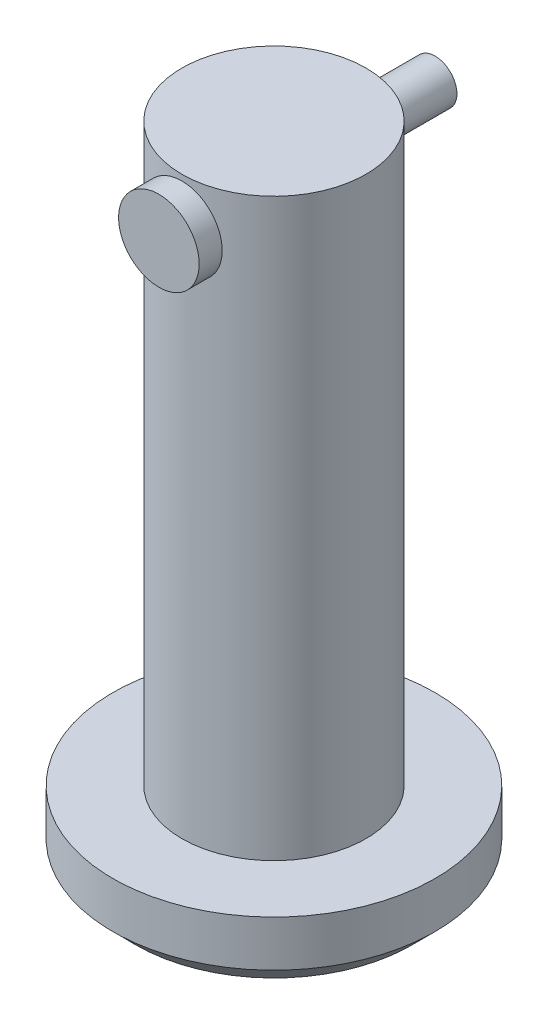
ISO-10303-21;
HEADER;
FILE_DESCRIPTION(('STEP AP214'),'2;1');
FILE_NAME('part.step','',(''),(''),'','','');
FILE_SCHEMA(('AUTOMOTIVE_DESIGN { 1 0 10303 214 1 1 1 1 }'));
ENDSEC;
DATA;
#1=APPLICATION_CONTEXT('core data for automotive mechanical design processes');
#2=APPLICATION_PROTOCOL_DEFINITION('international standard','automotive_design',2000,#1);
#3=PRODUCT_CONTEXT('',#1,'mechanical');
#4=PRODUCT('Part','Part','',(#3));
#5=PRODUCT_RELATED_PRODUCT_CATEGORY('part','',(#4));
#6=PRODUCT_DEFINITION_FORMATION('','',#4);
#7=PRODUCT_DEFINITION_CONTEXT('part definition',#1,'design');
#8=PRODUCT_DEFINITION('design','',#6,#7);
#9=PRODUCT_DEFINITION_SHAPE('','',#8);
#10=(LENGTH_UNIT() NAMED_UNIT(*) SI_UNIT(.MILLI.,.METRE.));
#11=(NAMED_UNIT(*) PLANE_ANGLE_UNIT() SI_UNIT($,.RADIAN.));
#12=(NAMED_UNIT(*) SI_UNIT($,.STERADIAN.) SOLID_ANGLE_UNIT());
#13=UNCERTAINTY_MEASURE_WITH_UNIT(LENGTH_MEASURE(1.E-05),#10,'distance_accuracy_value','');
#14=(GEOMETRIC_REPRESENTATION_CONTEXT(3) GLOBAL_UNCERTAINTY_ASSIGNED_CONTEXT((#13)) GLOBAL_UNIT_ASSIGNED_CONTEXT((#10,
#11,#12)) REPRESENTATION_CONTEXT('',''));
#15=CARTESIAN_POINT('',(0.,0.,0.));
#16=DIRECTION('',(0.,0.,1.));
#17=DIRECTION('',(1.,0.,0.));
#18=AXIS2_PLACEMENT_3D('',#15,#16,#17);
#19=CARTESIAN_POINT('',(0.,23.,-7.));
#20=DIRECTION('',(0.,0.,1.));
#21=DIRECTION('',(1.,0.,0.));
#22=AXIS2_PLACEMENT_3D('',#19,#20,#21);
#23=CYLINDRICAL_SURFACE('',#22,0.95);
#24=CARTESIAN_POINT('',(0.,23.,-7.));
#25=DIRECTION('',(0.,0.,1.));
#26=DIRECTION('',(1.,0.,0.));
#27=AXIS2_PLACEMENT_3D('',#24,#25,#26);
#28=CIRCLE('',#27,0.95);
#29=CARTESIAN_POINT('',(0.95,23.,-7.));
#30=VERTEX_POINT('',#29);
#31=EDGE_CURVE('E11',#30,#30,#28,.T.);
#32=ORIENTED_EDGE('',*,*,#31,.T.);
#33=EDGE_LOOP('',(#32));
#34=FACE_BOUND('',#33,.T.);
#35=CARTESIAN_POINT('',(0.,23.,4.));
#36=DIRECTION('',(0.,0.,1.));
#37=DIRECTION('',(1.,0.,0.));
#38=AXIS2_PLACEMENT_3D('',#35,#36,#37);
#39=CIRCLE('',#38,0.95);
#40=CARTESIAN_POINT('',(0.95,23.,4.));
#41=VERTEX_POINT('',#40);
#42=EDGE_CURVE('E41',#41,#41,#39,.F.);
#43=ORIENTED_EDGE('',*,*,#42,.T.);
#44=EDGE_LOOP('',(#43));
#45=FACE_BOUND('',#44,.T.);
#46=ADVANCED_FACE('F38',(#34,#45),#23,.T.);
#47=CARTESIAN_POINT('',(0.,23.,-7.));
#48=DIRECTION('',(0.,0.,1.));
#49=DIRECTION('',(1.,0.,0.));
#50=AXIS2_PLACEMENT_3D('',#47,#48,#49);
#51=PLANE('',#50);
#52=ORIENTED_EDGE('',*,*,#31,.F.);
#53=EDGE_LOOP('',(#52));
#54=FACE_BOUND('',#53,.T.);
#55=ADVANCED_FACE('F70',(#54),#51,.F.);
#56=CARTESIAN_POINT('',(0.,23.,4.));
#57=DIRECTION('',(0.,0.,1.));
#58=DIRECTION('',(1.,0.,0.));
#59=AXIS2_PLACEMENT_3D('',#56,#57,#58);
#60=CYLINDRICAL_SURFACE('',#59,1.75);
#61=CARTESIAN_POINT('',(0.,23.,4.));
#62=DIRECTION('',(0.,0.,1.));
#63=DIRECTION('',(1.,0.,0.));
#64=AXIS2_PLACEMENT_3D('',#61,#62,#63);
#65=CIRCLE('',#64,1.75);
#66=CARTESIAN_POINT('',(1.75,23.,4.));
#67=VERTEX_POINT('',#66);
#68=EDGE_CURVE('E48',#67,#67,#65,.T.);
#69=ORIENTED_EDGE('',*,*,#68,.T.);
#70=EDGE_LOOP('',(#69));
#71=FACE_BOUND('',#70,.T.);
#72=CARTESIAN_POINT('',(0.,23.,5.));
#73=DIRECTION('',(0.,0.,1.));
#74=DIRECTION('',(1.,0.,0.));
#75=AXIS2_PLACEMENT_3D('',#72,#73,#74);
#76=CIRCLE('',#75,1.75);
#77=CARTESIAN_POINT('',(1.75,23.,5.));
#78=VERTEX_POINT('',#77);
#79=EDGE_CURVE('E50',#78,#78,#76,.T.);
#80=ORIENTED_EDGE('',*,*,#79,.F.);
#81=EDGE_LOOP('',(#80));
#82=FACE_BOUND('',#81,.T.);
#83=ADVANCED_FACE('F56',(#71,#82),#60,.T.);
#84=CARTESIAN_POINT('',(0.,23.,4.));
#85=DIRECTION('',(0.,0.,1.));
#86=DIRECTION('',(1.,0.,0.));
#87=AXIS2_PLACEMENT_3D('',#84,#85,#86);
#88=PLANE('',#87);
#89=ORIENTED_EDGE('',*,*,#42,.F.);
#90=EDGE_LOOP('',(#89));
#91=FACE_BOUND('',#90,.T.);
#92=ORIENTED_EDGE('',*,*,#68,.F.);
#93=EDGE_LOOP('',(#92));
#94=FACE_BOUND('',#93,.T.);
#95=ADVANCED_FACE('F59',(#91,#94),#88,.F.);
#96=CARTESIAN_POINT('',(0.,23.,5.));
#97=DIRECTION('',(0.,0.,1.));
#98=DIRECTION('',(1.,0.,0.));
#99=AXIS2_PLACEMENT_3D('',#96,#97,#98);
#100=PLANE('',#99);
#101=ORIENTED_EDGE('',*,*,#79,.T.);
#102=EDGE_LOOP('',(#101));
#103=FACE_BOUND('',#102,.T.);
#104=ADVANCED_FACE('F61',(#103),#100,.T.);
#105=CLOSED_SHELL('',(#46,#55,#83,#95,#104));
#106=MANIFOLD_SOLID_BREP('B2',#105);
#107=CARTESIAN_POINT('',(0.,25.,0.));
#108=DIRECTION('',(0.,-1.,0.));
#109=DIRECTION('',(0.,0.,-1.));
#110=AXIS2_PLACEMENT_3D('',#107,#108,#109);
#111=CYLINDRICAL_SURFACE('',#110,4.);
#112=CARTESIAN_POINT('',(0.,25.,0.));
#113=DIRECTION('',(0.,1.,0.));
#114=DIRECTION('',(0.,0.,1.));
#115=AXIS2_PLACEMENT_3D('',#112,#113,#114);
#116=CIRCLE('',#115,4.);
#117=CARTESIAN_POINT('',(0.,25.,4.));
#118=VERTEX_POINT('',#117);
#119=EDGE_CURVE('E128',#118,#118,#116,.T.);
#120=ORIENTED_EDGE('',*,*,#119,.F.);
#121=EDGE_LOOP('',(#120));
#122=FACE_BOUND('',#121,.T.);
#123=CARTESIAN_POINT('',(0.,0.,0.));
#124=DIRECTION('',(0.,-1.,0.));
#125=DIRECTION('',(0.,0.,-1.));
#126=AXIS2_PLACEMENT_3D('',#123,#124,#125);
#127=CIRCLE('',#126,4.);
#128=CARTESIAN_POINT('',(0.,0.,-4.));
#129=VERTEX_POINT('',#128);
#130=EDGE_CURVE('E163',#129,#129,#127,.T.);
#131=ORIENTED_EDGE('',*,*,#130,.F.);
#132=EDGE_LOOP('',(#131));
#133=FACE_BOUND('',#132,.T.);
#134=CARTESIAN_POINT('',(-1.,23.,3.87298334620742));
#135=CARTESIAN_POINT('',(-0.9999984314387,22.9447796996432,3.87298440057185));
#136=CARTESIAN_POINT('',(-0.99541049820807,22.8895420405686,3.87417722499278));
#137=CARTESIAN_POINT('',(-0.977209250194447,22.7806529687674,3.87880744892249));
#138=CARTESIAN_POINT('',(-0.963590682698078,22.72700249822,3.8822461547418));
#139=CARTESIAN_POINT('',(-0.927796479849635,22.6228785847122,3.89095489813012));
#140=CARTESIAN_POINT('',(-0.905631891140944,22.5724011378422,3.8962225706936));
#141=CARTESIAN_POINT('',(-0.853408456505407,22.4758756589875,3.90799276818327));
#142=CARTESIAN_POINT('',(-0.823349275424506,22.4298278151689,3.91449534553241));
#143=CARTESIAN_POINT('',(-0.755483370924518,22.3424553418942,3.92816286540368));
#144=CARTESIAN_POINT('',(-0.717534755081558,22.3012425598597,3.93533839048709));
#145=CARTESIAN_POINT('',(-0.635272825640328,22.2256954422561,3.94945150206622));
#146=CARTESIAN_POINT('',(-0.59095891767214,22.1913617497514,3.95638906626691));
#147=CARTESIAN_POINT('',(-0.496458080431565,22.1300898129474,3.96936166208095));
#148=CARTESIAN_POINT('',(-0.446197830478043,22.1032614447354,3.975382749602));
#149=CARTESIAN_POINT('',(-0.341705273717109,22.0584761423388,3.9857232477043));
#150=CARTESIAN_POINT('',(-0.287473554316776,22.0405178992338,3.99004290933747));
#151=CARTESIAN_POINT('',(-0.177743503501662,22.0143408661686,3.99641903539262));
#152=CARTESIAN_POINT('',(-0.122293087819589,22.0059321422694,3.99851957537723));
#153=CARTESIAN_POINT('',(-0.010731527705107,21.9984966482898,4.00037437642922));
#154=CARTESIAN_POINT('',(0.0453795178152283,21.9994684911162,4.00012898438682));
#155=CARTESIAN_POINT('',(0.155352247172388,22.0106299401001,3.99735237981413));
#156=CARTESIAN_POINT('',(0.209236215601068,22.0206145300215,3.99487200936349));
#157=CARTESIAN_POINT('',(0.314538247413687,22.0491885080194,3.98796334609942));
#158=CARTESIAN_POINT('',(0.365956179370439,22.067778354151,3.98353494959376));
#159=CARTESIAN_POINT('',(0.465406703501808,22.1132010282748,3.97315003880358));
#160=CARTESIAN_POINT('',(0.513404509766506,22.1401068178647,3.96718007878021));
#161=CARTESIAN_POINT('',(0.60427562234049,22.2013422716465,3.9543596152386));
#162=CARTESIAN_POINT('',(0.647148035085507,22.2356732274242,3.94750895860996));
#163=CARTESIAN_POINT('',(0.727774035084958,22.3118834967929,3.93345485507808));
#164=CARTESIAN_POINT('',(0.765357679075201,22.3539419569391,3.92624687810367));
#165=CARTESIAN_POINT('',(0.83297637596302,22.4438399894161,3.91246017406682));
#166=CARTESIAN_POINT('',(0.863011076046018,22.4916798317964,3.90588147642388));
#167=CARTESIAN_POINT('',(0.914788129022599,22.5921160136596,3.89408198732659));
#168=CARTESIAN_POINT('',(0.936489566970492,22.6447342921253,3.88886793490288));
#169=CARTESIAN_POINT('',(0.970685620636342,22.7530341872306,3.88047456055983));
#170=CARTESIAN_POINT('',(0.983182206552911,22.8087151455933,3.87729480324087));
#171=CARTESIAN_POINT('',(0.998331855466071,22.9199838006093,3.87342142415656));
#172=CARTESIAN_POINT('',(1.00123618956785,22.9755351173319,3.87266435637459));
#173=CARTESIAN_POINT('',(0.997806796206219,23.0863287746313,3.87354937392416));
#174=CARTESIAN_POINT('',(0.991473919139521,23.1415711431805,3.87519123840506));
#175=CARTESIAN_POINT('',(0.969970185575065,23.2492457059819,3.88062832781824));
#176=CARTESIAN_POINT('',(0.954945627312698,23.3017090906283,3.8843878809375));
#177=CARTESIAN_POINT('',(0.916647232668248,23.4033725831407,3.89360287308385));
#178=CARTESIAN_POINT('',(0.893372419085019,23.4525723036221,3.89905851299445));
#179=CARTESIAN_POINT('',(0.838708267174624,23.5473765111469,3.91118454837305));
#180=CARTESIAN_POINT('',(0.807168701534252,23.5928915360172,3.91787667442657));
#181=CARTESIAN_POINT('',(0.737060292934456,23.6780753451205,3.93166833228686));
#182=CARTESIAN_POINT('',(0.69849029480544,23.71774316666,3.93876793091388));
#183=CARTESIAN_POINT('',(0.614262720984726,23.7911244170284,3.95278961212642));
#184=CARTESIAN_POINT('',(0.568451952531594,23.8246640250195,3.95970280824734));
#185=CARTESIAN_POINT('',(0.471702682694676,23.8835743467805,3.97238886645494));
#186=CARTESIAN_POINT('',(0.420764448957591,23.9089454866433,3.97816178801584));
#187=CARTESIAN_POINT('',(0.31555820173109,23.9505784138112,3.98788046295326));
#188=CARTESIAN_POINT('',(0.261317381027881,23.9669057137516,3.99183932008964));
#189=CARTESIAN_POINT('',(0.150749760318808,23.9901841338434,3.99754117358315));
#190=CARTESIAN_POINT('',(0.0944233650412436,23.9971370634956,3.99928459757363));
#191=CARTESIAN_POINT('',(-0.0170835264433265,24.0013675895755,4.00034169408811));
#192=CARTESIAN_POINT('',(-0.0722538269660333,23.9989017090954,3.99971978880008));
#193=CARTESIAN_POINT('',(-0.18136749641474,23.9849521727057,3.99625896457423));
#194=CARTESIAN_POINT('',(-0.235310901780888,23.9734687849869,3.99342011157094));
#195=CARTESIAN_POINT('',(-0.340171035644817,23.9419477802291,3.98585432853963));
#196=CARTESIAN_POINT('',(-0.391102494581019,23.9219565466854,3.98113764502668));
#197=CARTESIAN_POINT('',(-0.488917053041468,23.8740294209807,3.97031288913382));
#198=CARTESIAN_POINT('',(-0.535799641265051,23.8460925273304,3.96420464137727));
#199=CARTESIAN_POINT('',(-0.625401928423902,23.7822847660029,3.95107249681342));
#200=CARTESIAN_POINT('',(-0.667994988300589,23.7462398570926,3.94403016945646));
#201=CARTESIAN_POINT('',(-0.746615020271254,23.6675771480262,3.92990649053207));
#202=CARTESIAN_POINT('',(-0.782640325068179,23.6249576839021,3.92282512952424));
#203=CARTESIAN_POINT('',(-0.84776202647924,23.5333985857987,3.90927475860683));
#204=CARTESIAN_POINT('',(-0.876716619446592,23.4843558765875,3.90281963730391));
#205=CARTESIAN_POINT('',(-0.925926896615621,23.3819445100772,3.8914395555011));
#206=CARTESIAN_POINT('',(-0.946188909759557,23.3285790338927,3.88651348244814));
#207=CARTESIAN_POINT('',(-0.974422528565572,23.2294229881737,3.87951908741315));
#208=CARTESIAN_POINT('',(-0.98399317059583,23.1841068356176,3.87708663005761));
#209=CARTESIAN_POINT('',(-0.99678229257282,23.0925311309985,3.87381838580358));
#210=CARTESIAN_POINT('',(-1.00000131437052,23.0462716597494,3.87298246270639));
#211=CARTESIAN_POINT('',(-1.,23.,3.87298334620742));
#212=B_SPLINE_CURVE_WITH_KNOTS('',3,(#134,#135,#136,#137,#138,#139,#140,#141,#142,#143,#144,
#145,#146,#147,#148,#149,#150,#151,#152,#153,#154,#155,#156,#157,#158,#159,#160,#161,#162,#163,
#164,#165,#166,#167,#168,#169,#170,#171,#172,#173,#174,#175,#176,#177,#178,#179,#180,#181,#182,
#183,#184,#185,#186,#187,#188,#189,#190,#191,#192,#193,#194,#195,#196,#197,#198,#199,#200,#201,
#202,#203,#204,#205,#206,#207,#208,#209,#210,#211),.UNSPECIFIED.,.T.,.F.,(4,2,2,2,2,2,2,2,2,2,2,
2,2,2,2,2,2,2,2,2,2,2,2,2,2,2,2,2,2,2,2,2,2,2,2,2,2,2,4),(0.,0.16549097667523,0.331078296534212,
0.496452290829153,0.66183330698466,0.830495816734651,0.999174085882213,1.17020598555443,
1.34121263935112,1.50875500394413,1.67627259462683,1.84007305071853,2.00388222686189,
2.16917149698053,2.3344895418384,2.50428186625039,2.67408212476196,2.84470572799636,
3.01529280048094,3.18137429900962,3.34744050869796,3.51078961999958,3.67415808564842,
3.84073138339938,4.00733207550293,4.17810132382402,4.34886166284096,4.51836829119047,
4.6878421955989,4.85273378447258,5.01762046947067,5.18161950620159,5.34563922291504,
5.51358838629103,5.68158012622478,5.85270590910145,6.02370688542923,6.16239130867207,
6.30106390036083),.UNSPECIFIED.);
#213=CARTESIAN_POINT('',(-1.,23.,3.87298334620742));
#214=VERTEX_POINT('',#213);
#215=EDGE_CURVE('E131',#214,#214,#212,.T.);
#216=ORIENTED_EDGE('',*,*,#215,.F.);
#217=EDGE_LOOP('',(#216));
#218=FACE_BOUND('',#217,.T.);
#219=CARTESIAN_POINT('',(0.,24.,-4.));
#220=CARTESIAN_POINT('',(0.0552507257798205,23.9999984495079,-3.99999906578675));
#221=CARTESIAN_POINT('',(0.110518771887175,23.9954056328175,-3.99884385421219));
#222=CARTESIAN_POINT('',(0.219470882513688,23.977183232462,-3.99434742553261));
#223=CARTESIAN_POINT('',(0.27315403124716,23.9635485269748,-3.99100496946646));
#224=CARTESIAN_POINT('',(0.377347248121718,23.9277071643586,-3.98250417554693));
#225=CARTESIAN_POINT('',(0.427861042286669,23.9055108008565,-3.97734801894725));
#226=CARTESIAN_POINT('',(0.524448087936285,23.8532124066368,-3.96576895871729));
#227=CARTESIAN_POINT('',(0.57052118956584,23.823110109254,-3.95934601236034));
#228=CARTESIAN_POINT('',(0.657867951533946,23.7551994735639,-3.94578275727868));
#229=CARTESIAN_POINT('',(0.69903712670738,23.7172589500272,-3.93863138099022));
#230=CARTESIAN_POINT('',(0.774499284802202,23.6350318633941,-3.92449080078353));
#231=CARTESIAN_POINT('',(0.808791491299423,23.5907445847023,-3.91750161525566));
#232=CARTESIAN_POINT('',(0.870017695199355,23.4962698488417,-3.9043651713314));
#233=CARTESIAN_POINT('',(0.896834810616905,23.4460045127931,-3.89823196313737));
#234=CARTESIAN_POINT('',(0.941597939033685,23.3415010588944,-3.88766329874815));
#235=CARTESIAN_POINT('',(0.959545370292889,23.2872635777828,-3.88322757115193));
#236=CARTESIAN_POINT('',(0.985703224536194,23.1775043345317,-3.87666984478367));
#237=CARTESIAN_POINT('',(0.994101512222227,23.1220300693001,-3.87450327383617));
#238=CARTESIAN_POINT('',(1.00150785004524,23.0104209539907,-3.8725957502516));
#239=CARTESIAN_POINT('',(1.00051742787865,22.9542862128676,-3.87285440299096));
#240=CARTESIAN_POINT('',(0.989324349759521,22.8443894615037,-3.87572803664412));
#241=CARTESIAN_POINT('',(0.979345560127014,22.7906029190233,-3.87828575334586));
#242=CARTESIAN_POINT('',(0.950816124602072,22.6854926327258,-3.88537806450989));
#243=CARTESIAN_POINT('',(0.932264868046283,22.6341690646473,-3.88991279980464));
#244=CARTESIAN_POINT('',(0.88692631862477,22.5348413224986,-3.90050075936124));
#245=CARTESIAN_POINT('',(0.860057778155276,22.4868758854736,-3.90656884979614));
#246=CARTESIAN_POINT('',(0.798904184009971,22.3960541934954,-3.91953140564257));
#247=CARTESIAN_POINT('',(0.764617832539226,22.3531988346218,-3.9264260155649));
#248=CARTESIAN_POINT('',(0.688442283120811,22.2725309228704,-3.94050587026521));
#249=CARTESIAN_POINT('',(0.646364172110573,22.2348970066258,-3.94769379651981));
#250=CARTESIAN_POINT('',(0.556407945002467,22.1671858383574,-3.96137310385857));
#251=CARTESIAN_POINT('',(0.508529651805297,22.1371088171576,-3.96786446366277));
#252=CARTESIAN_POINT('',(0.408077259120928,22.0852996091837,-3.97945154729455));
#253=CARTESIAN_POINT('',(0.355487595472415,22.0635964398304,-3.9845424008515));
#254=CARTESIAN_POINT('',(0.247250672095254,22.0293884628603,-3.99271944660946));
#255=CARTESIAN_POINT('',(0.191603999433655,22.0168818957212,-3.99580602226187));
#256=CARTESIAN_POINT('',(0.0803599802600161,22.0016949562941,-3.9995699951425));
#257=CARTESIAN_POINT('',(0.0247978133254715,21.9987713159498,-4.00030702338852));
#258=CARTESIAN_POINT('',(-0.0860219165343399,22.0021660013703,-3.999458698763));
#259=CARTESIAN_POINT('',(-0.141279506429731,22.0084834951994,-3.99787355494564));
#260=CARTESIAN_POINT('',(-0.249076179184328,22.0299806055943,-3.99259720751571));
#261=CARTESIAN_POINT('',(-0.301643412645836,22.0450275089847,-3.98893756123874));
#262=CARTESIAN_POINT('',(-0.403504861635007,22.0834047226856,-3.97992471089423));
#263=CARTESIAN_POINT('',(-0.452798746021757,22.1067358695421,-3.97457133579928));
#264=CARTESIAN_POINT('',(-0.547682089619898,22.1614907525832,-3.96262205284207));
#265=CARTESIAN_POINT('',(-0.59319029455722,22.1930507415978,-3.95600578244621));
#266=CARTESIAN_POINT('',(-0.678351075762164,22.2631932725313,-3.94229672791613));
#267=CARTESIAN_POINT('',(-0.71800263931534,22.3017770264113,-3.93520386167803));
#268=CARTESIAN_POINT('',(-0.791327045381822,22.3860013072296,-3.92112637973847));
#269=CARTESIAN_POINT('',(-0.824829245081355,22.4317918020016,-3.91414869458187));
#270=CARTESIAN_POINT('',(-0.883673839341799,22.5284884229771,-3.90128585584826));
#271=CARTESIAN_POINT('',(-0.909016596105291,22.5793943219732,-3.89540065378017));
#272=CARTESIAN_POINT('',(-0.950634280406195,22.6846038149421,-3.88545396489777));
#273=CARTESIAN_POINT('',(-0.966962931102711,22.7388850855627,-3.88138170194604));
#274=CARTESIAN_POINT('',(-0.990230439969187,22.8495397585927,-3.87551162726789));
#275=CARTESIAN_POINT('',(-0.997171351652439,22.9059127006883,-3.87371331813291));
#276=CARTESIAN_POINT('',(-1.00135906022266,23.0174140159035,-3.87263267469304));
#277=CARTESIAN_POINT('',(-0.998878598520079,23.0725316234165,-3.87327955152176));
#278=CARTESIAN_POINT('',(-0.984918185541912,23.1815359257787,-3.87685272671895));
#279=CARTESIAN_POINT('',(-0.973438415124514,23.2354226453424,-3.87977897927904));
#280=CARTESIAN_POINT('',(-0.941954212961864,23.3401389727103,-3.88754173788482));
#281=CARTESIAN_POINT('',(-0.922000936453585,23.3909848701601,-3.89236676824206));
#282=CARTESIAN_POINT('',(-0.874176609070048,23.4886435884758,-3.90338503816552));
#283=CARTESIAN_POINT('',(-0.846304460022793,23.5354558487913,-3.90957846747182));
#284=CARTESIAN_POINT('',(-0.782578499091425,23.6250364193347,-3.92283756175675));
#285=CARTESIAN_POINT('',(-0.746535441941504,23.6676673822826,-3.92992176554505));
#286=CARTESIAN_POINT('',(-0.667859580793158,23.7463646965303,-3.94405351497524));
#287=CARTESIAN_POINT('',(-0.625225214174097,23.782429486742,-3.95110105151373));
#288=CARTESIAN_POINT('',(-0.533645057801727,23.8476075390431,-3.96451770431775));
#289=CARTESIAN_POINT('',(-0.484598948210924,23.8765830757811,-3.97087222243912));
#290=CARTESIAN_POINT('',(-0.382177373006984,23.9258316419604,-3.98203283316746));
#291=CARTESIAN_POINT('',(-0.32880504229116,23.946110907099,-3.98684003466521));
#292=CARTESIAN_POINT('',(-0.229606835495648,23.9743812202198,-3.99365373043694));
#293=CARTESIAN_POINT('',(-0.184253447272046,23.983967495369,-3.9960172336846));
#294=CARTESIAN_POINT('',(-0.092604047690856,23.996777295748,-3.99919070154632));
#295=CARTESIAN_POINT('',(-0.0463081074950778,24.0000012995369,-4.00000078300596));
#296=CARTESIAN_POINT('',(0.,24.,-4.));
#297=B_SPLINE_CURVE_WITH_KNOTS('',3,(#219,#220,#221,#222,#223,#224,#225,#226,#227,#228,#229,
#230,#231,#232,#233,#234,#235,#236,#237,#238,#239,#240,#241,#242,#243,#244,#245,#246,#247,#248,
#249,#250,#251,#252,#253,#254,#255,#256,#257,#258,#259,#260,#261,#262,#263,#264,#265,#266,#267,
#268,#269,#270,#271,#272,#273,#274,#275,#276,#277,#278,#279,#280,#281,#282,#283,#284,#285,#286,
#287,#288,#289,#290,#291,#292,#293,#294,#295,#296),.UNSPECIFIED.,.T.,.F.,(4,2,2,2,2,2,2,2,2,2,2,
2,2,2,2,2,2,2,2,2,2,2,2,2,2,2,2,2,2,2,2,2,2,2,2,2,2,2,4),(0.,0.165582474981259,
0.331258825175933,0.496736601524071,0.662219960112886,0.830762902914258,0.999324863867077,
1.17039098363871,1.34142974112912,1.50904196732954,1.67662692075132,1.84014998004679,
2.00368468977359,2.16887018582586,2.33408460557442,2.50401000646013,2.67394059705498,
2.84445486006076,3.01493649125762,3.18105539299518,3.34715934075162,3.51080183009358,
3.67446084881527,3.84102391710235,4.0076157533868,4.17829672802984,4.34897012499673,
4.51861503076025,4.68822282168272,4.85295853599075,5.0176909397069,5.18144267039632,
5.34521712091268,5.51326384273274,5.68135046513612,5.85248123666392,6.02348909214234,
6.16228161961433,6.3010637069536),.UNSPECIFIED.);
#298=CARTESIAN_POINT('',(0.,24.,-4.));
#299=VERTEX_POINT('',#298);
#300=EDGE_CURVE('E115',#299,#299,#297,.T.);
#301=ORIENTED_EDGE('',*,*,#300,.F.);
#302=EDGE_LOOP('',(#301));
#303=FACE_BOUND('',#302,.T.);
#304=ADVANCED_FACE('F111',(#122,#133,#218,#303),#111,.T.);
#305=CARTESIAN_POINT('',(0.,25.,0.));
#306=DIRECTION('',(0.,1.,0.));
#307=DIRECTION('',(0.,0.,1.));
#308=AXIS2_PLACEMENT_3D('',#305,#306,#307);
#309=PLANE('',#308);
#310=ORIENTED_EDGE('',*,*,#119,.T.);
#311=EDGE_LOOP('',(#310));
#312=FACE_BOUND('',#311,.T.);
#313=ADVANCED_FACE('F154',(#312),#309,.T.);
#314=CARTESIAN_POINT('',(0.,-3.,0.));
#315=DIRECTION('',(0.,1.,0.));
#316=DIRECTION('',(0.,0.,1.));
#317=AXIS2_PLACEMENT_3D('',#314,#315,#316);
#318=CYLINDRICAL_SURFACE('',#317,7.);
#319=CARTESIAN_POINT('',(0.,-1.99999999999999,0.));
#320=DIRECTION('',(0.,-1.,0.));
#321=DIRECTION('',(0.,0.,-1.));
#322=AXIS2_PLACEMENT_3D('',#319,#320,#321);
#323=CIRCLE('',#322,7.);
#324=CARTESIAN_POINT('',(0.,-1.99999999999999,-7.));
#325=VERTEX_POINT('',#324);
#326=EDGE_CURVE('E37',#325,#325,#323,.F.);
#327=ORIENTED_EDGE('',*,*,#326,.T.);
#328=EDGE_LOOP('',(#327));
#329=FACE_BOUND('',#328,.T.);
#330=CARTESIAN_POINT('',(0.,0.,0.));
#331=DIRECTION('',(0.,-1.,0.));
#332=DIRECTION('',(0.,0.,-1.));
#333=AXIS2_PLACEMENT_3D('',#330,#331,#332);
#334=CIRCLE('',#333,7.);
#335=CARTESIAN_POINT('',(0.,0.,-7.));
#336=VERTEX_POINT('',#335);
#337=EDGE_CURVE('E165',#336,#336,#334,.T.);
#338=ORIENTED_EDGE('',*,*,#337,.T.);
#339=EDGE_LOOP('',(#338));
#340=FACE_BOUND('',#339,.T.);
#341=ADVANCED_FACE('F148',(#329,#340),#318,.T.);
#342=CARTESIAN_POINT('',(0.,-3.,0.));
#343=DIRECTION('',(0.,-1.,0.));
#344=DIRECTION('',(0.,0.,-1.));
#345=AXIS2_PLACEMENT_3D('',#342,#343,#344);
#346=PLANE('',#345);
#347=CARTESIAN_POINT('',(0.,-3.,0.));
#348=DIRECTION('',(0.,-1.,0.));
#349=DIRECTION('',(0.,0.,-1.));
#350=AXIS2_PLACEMENT_3D('',#347,#348,#349);
#351=CIRCLE('',#350,6.);
#352=CARTESIAN_POINT('',(0.,-3.,-6.));
#353=VERTEX_POINT('',#352);
#354=EDGE_CURVE('E123',#353,#353,#351,.T.);
#355=ORIENTED_EDGE('',*,*,#354,.T.);
#356=EDGE_LOOP('',(#355));
#357=FACE_BOUND('',#356,.T.);
#358=ADVANCED_FACE('F143',(#357),#346,.T.);
#359=CARTESIAN_POINT('',(0.,0.,0.));
#360=DIRECTION('',(0.,-1.,0.));
#361=DIRECTION('',(0.,0.,-1.));
#362=AXIS2_PLACEMENT_3D('',#359,#360,#361);
#363=PLANE('',#362);
#364=ORIENTED_EDGE('',*,*,#130,.T.);
#365=EDGE_LOOP('',(#364));
#366=FACE_BOUND('',#365,.T.);
#367=ORIENTED_EDGE('',*,*,#337,.F.);
#368=EDGE_LOOP('',(#367));
#369=FACE_BOUND('',#368,.T.);
#370=ADVANCED_FACE('F147',(#366,#369),#363,.F.);
#371=CARTESIAN_POINT('',(0.,-3.,0.));
#372=DIRECTION('',(0.,1.,0.));
#373=DIRECTION('',(0.,0.,1.));
#374=AXIS2_PLACEMENT_3D('',#371,#372,#373);
#375=CONICAL_SURFACE('',#374,6.,0.785398163397447);
#376=ORIENTED_EDGE('',*,*,#326,.F.);
#377=EDGE_LOOP('',(#376));
#378=FACE_BOUND('',#377,.T.);
#379=ORIENTED_EDGE('',*,*,#354,.F.);
#380=EDGE_LOOP('',(#379));
#381=FACE_BOUND('',#380,.T.);
#382=ADVANCED_FACE('F113',(#378,#381),#375,.T.);
#383=CARTESIAN_POINT('',(0.,23.,10.));
#384=DIRECTION('',(0.,0.,-1.));
#385=DIRECTION('',(-1.,0.,0.));
#386=AXIS2_PLACEMENT_3D('',#383,#384,#385);
#387=CYLINDRICAL_SURFACE('',#386,1.);
#388=ORIENTED_EDGE('',*,*,#215,.T.);
#389=EDGE_LOOP('',(#388));
#390=FACE_BOUND('',#389,.T.);
#391=ORIENTED_EDGE('',*,*,#300,.T.);
#392=EDGE_LOOP('',(#391));
#393=FACE_BOUND('',#392,.T.);
#394=ADVANCED_FACE('F138',(#390,#393),#387,.F.);
#395=CLOSED_SHELL('',(#304,#313,#341,#358,#370,#382,#394));
#396=MANIFOLD_SOLID_BREP('B6',#395);
#397=ADVANCED_BREP_SHAPE_REPRESENTATION('',(#18,#106,#396),#14);
#398=SHAPE_DEFINITION_REPRESENTATION(#9,#397);
ENDSEC;
END-ISO-10303-21;
